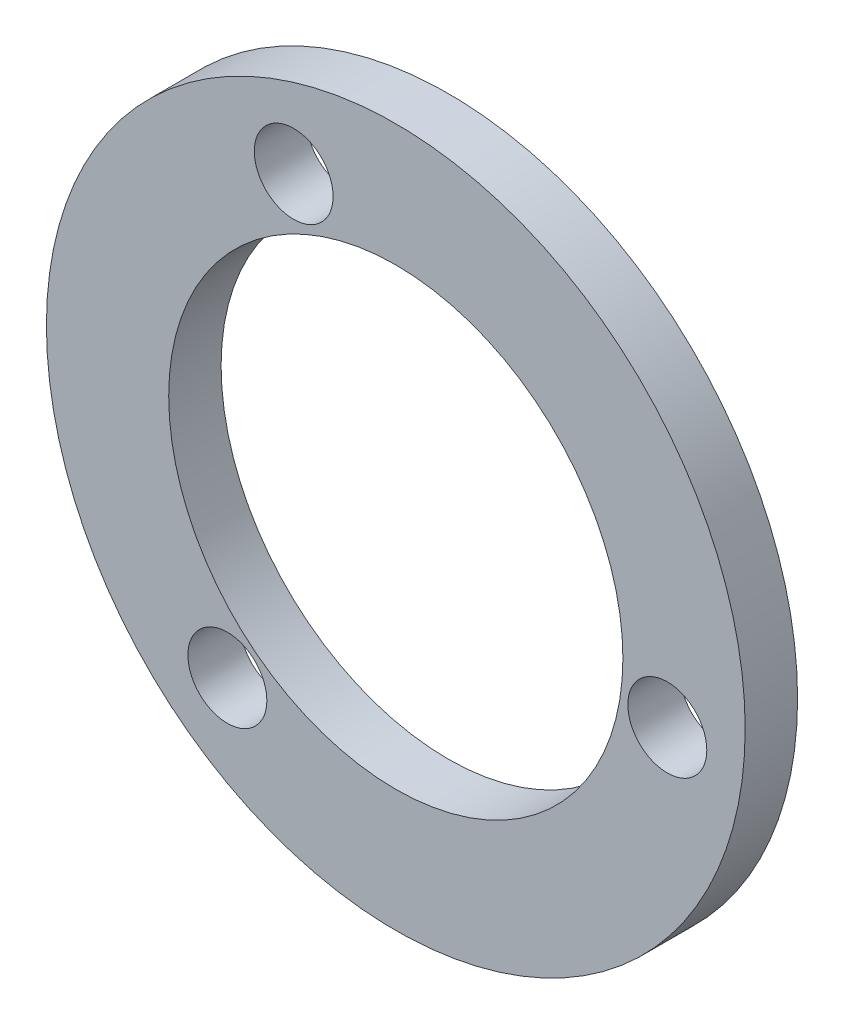
ISO-10303-21;
HEADER;
FILE_DESCRIPTION(('STEP AP214'),'2;1');
FILE_NAME('part.step','',(''),(''),'','','');
FILE_SCHEMA(('AUTOMOTIVE_DESIGN { 1 0 10303 214 1 1 1 1 }'));
ENDSEC;
DATA;
#1=APPLICATION_CONTEXT('core data for automotive mechanical design processes');
#2=APPLICATION_PROTOCOL_DEFINITION('international standard','automotive_design',2000,#1);
#3=PRODUCT_CONTEXT('',#1,'mechanical');
#4=PRODUCT('Part','Part','',(#3));
#5=PRODUCT_RELATED_PRODUCT_CATEGORY('part','',(#4));
#6=PRODUCT_DEFINITION_FORMATION('','',#4);
#7=PRODUCT_DEFINITION_CONTEXT('part definition',#1,'design');
#8=PRODUCT_DEFINITION('design','',#6,#7);
#9=PRODUCT_DEFINITION_SHAPE('','',#8);
#10=(LENGTH_UNIT() NAMED_UNIT(*) SI_UNIT(.MILLI.,.METRE.));
#11=(NAMED_UNIT(*) PLANE_ANGLE_UNIT() SI_UNIT($,.RADIAN.));
#12=(NAMED_UNIT(*) SI_UNIT($,.STERADIAN.) SOLID_ANGLE_UNIT());
#13=UNCERTAINTY_MEASURE_WITH_UNIT(LENGTH_MEASURE(1.E-05),#10,'distance_accuracy_value','');
#14=(GEOMETRIC_REPRESENTATION_CONTEXT(3) GLOBAL_UNCERTAINTY_ASSIGNED_CONTEXT((#13)) GLOBAL_UNIT_ASSIGNED_CONTEXT((#10,
#11,#12)) REPRESENTATION_CONTEXT('',''));
#15=CARTESIAN_POINT('',(0.,0.,0.));
#16=DIRECTION('',(0.,0.,1.));
#17=DIRECTION('',(1.,0.,0.));
#18=AXIS2_PLACEMENT_3D('',#15,#16,#17);
#19=CARTESIAN_POINT('',(197.599478725241,433.875501537189,3.));
#20=DIRECTION('',(0.,0.,1.));
#21=DIRECTION('',(1.,0.,0.));
#22=AXIS2_PLACEMENT_3D('',#19,#20,#21);
#23=PLANE('',#22);
#24=CARTESIAN_POINT('',(213.141718209666,431.718291045942,3.));
#25=DIRECTION('',(0.,0.,1.));
#26=DIRECTION('',(1.,0.,0.));
#27=AXIS2_PLACEMENT_3D('',#24,#25,#26);
#28=CIRCLE('',#27,2.25981114524068);
#29=CARTESIAN_POINT('',(215.401529354907,431.718291045942,3.));
#30=VERTEX_POINT('',#29);
#31=EDGE_CURVE('E64',#30,#30,#28,.T.);
#32=ORIENTED_EDGE('',*,*,#31,.F.);
#33=EDGE_LOOP('',(#32));
#34=FACE_BOUND('',#33,.T.);
#35=CARTESIAN_POINT('',(197.599478725241,433.875501537189,3.));
#36=DIRECTION('',(0.,0.,1.));
#37=DIRECTION('',(1.,0.,0.));
#38=AXIS2_PLACEMENT_3D('',#35,#36,#37);
#39=CIRCLE('',#38,13.);
#40=CARTESIAN_POINT('',(210.599478725241,433.875501537189,3.));
#41=VERTEX_POINT('',#40);
#42=EDGE_CURVE('E50',#41,#41,#39,.T.);
#43=ORIENTED_EDGE('',*,*,#42,.F.);
#44=EDGE_LOOP('',(#43));
#45=FACE_BOUND('',#44,.T.);
#46=CARTESIAN_POINT('',(197.599478725241,433.875501537189,3.));
#47=DIRECTION('',(0.,0.,1.));
#48=DIRECTION('',(1.,0.,0.));
#49=AXIS2_PLACEMENT_3D('',#46,#47,#48);
#50=CIRCLE('',#49,20.);
#51=CARTESIAN_POINT('',(217.599478725241,433.875501537189,3.));
#52=VERTEX_POINT('',#51);
#53=EDGE_CURVE('E10',#52,#52,#50,.T.);
#54=ORIENTED_EDGE('',*,*,#53,.T.);
#55=EDGE_LOOP('',(#54));
#56=FACE_BOUND('',#55,.T.);
#57=CARTESIAN_POINT('',(191.754521775831,448.464909960612,3.));
#58=DIRECTION('',(0.,0.,1.));
#59=DIRECTION('',(1.,0.,0.));
#60=AXIS2_PLACEMENT_3D('',#57,#58,#59);
#61=CIRCLE('',#60,2.25520833087926);
#62=CARTESIAN_POINT('',(194.00973010671,448.464909960612,3.));
#63=VERTEX_POINT('',#62);
#64=EDGE_CURVE('E56',#63,#63,#61,.T.);
#65=ORIENTED_EDGE('',*,*,#64,.F.);
#66=EDGE_LOOP('',(#65));
#67=FACE_BOUND('',#66,.T.);
#68=CARTESIAN_POINT('',(187.958721116064,421.587983347005,3.));
#69=DIRECTION('',(0.,0.,1.));
#70=DIRECTION('',(1.,0.,0.));
#71=AXIS2_PLACEMENT_3D('',#68,#69,#70);
#72=CIRCLE('',#71,2.26019180092882);
#73=CARTESIAN_POINT('',(190.218912916993,421.587983347005,3.));
#74=VERTEX_POINT('',#73);
#75=EDGE_CURVE('E72',#74,#74,#72,.T.);
#76=ORIENTED_EDGE('',*,*,#75,.F.);
#77=EDGE_LOOP('',(#76));
#78=FACE_BOUND('',#77,.T.);
#79=ADVANCED_FACE('F37',(#34,#45,#56,#67,#78),#23,.T.);
#80=CARTESIAN_POINT('',(197.599478725241,433.875501537189,0.));
#81=DIRECTION('',(0.,0.,1.));
#82=DIRECTION('',(1.,0.,0.));
#83=AXIS2_PLACEMENT_3D('',#80,#81,#82);
#84=PLANE('',#83);
#85=CARTESIAN_POINT('',(197.599478725241,433.875501537189,0.));
#86=DIRECTION('',(0.,0.,1.));
#87=DIRECTION('',(1.,0.,0.));
#88=AXIS2_PLACEMENT_3D('',#85,#86,#87);
#89=CIRCLE('',#88,20.);
#90=CARTESIAN_POINT('',(217.599478725241,433.875501537189,0.));
#91=VERTEX_POINT('',#90);
#92=EDGE_CURVE('E41',#91,#91,#89,.T.);
#93=ORIENTED_EDGE('',*,*,#92,.F.);
#94=EDGE_LOOP('',(#93));
#95=FACE_BOUND('',#94,.T.);
#96=CARTESIAN_POINT('',(197.599478725241,433.875501537189,0.));
#97=DIRECTION('',(0.,0.,1.));
#98=DIRECTION('',(1.,0.,0.));
#99=AXIS2_PLACEMENT_3D('',#96,#97,#98);
#100=CIRCLE('',#99,13.);
#101=CARTESIAN_POINT('',(210.599478725241,433.875501537189,0.));
#102=VERTEX_POINT('',#101);
#103=EDGE_CURVE('E52',#102,#102,#100,.T.);
#104=ORIENTED_EDGE('',*,*,#103,.T.);
#105=EDGE_LOOP('',(#104));
#106=FACE_BOUND('',#105,.T.);
#107=CARTESIAN_POINT('',(191.754521775831,448.464909960612,0.));
#108=DIRECTION('',(0.,0.,1.));
#109=DIRECTION('',(1.,0.,0.));
#110=AXIS2_PLACEMENT_3D('',#107,#108,#109);
#111=CIRCLE('',#110,2.25520833087926);
#112=CARTESIAN_POINT('',(194.00973010671,448.464909960612,0.));
#113=VERTEX_POINT('',#112);
#114=EDGE_CURVE('E60',#113,#113,#111,.T.);
#115=ORIENTED_EDGE('',*,*,#114,.T.);
#116=EDGE_LOOP('',(#115));
#117=FACE_BOUND('',#116,.T.);
#118=CARTESIAN_POINT('',(213.141718209666,431.718291045942,0.));
#119=DIRECTION('',(0.,0.,1.));
#120=DIRECTION('',(1.,0.,0.));
#121=AXIS2_PLACEMENT_3D('',#118,#119,#120);
#122=CIRCLE('',#121,2.25981114524068);
#123=CARTESIAN_POINT('',(215.401529354907,431.718291045942,0.));
#124=VERTEX_POINT('',#123);
#125=EDGE_CURVE('E68',#124,#124,#122,.T.);
#126=ORIENTED_EDGE('',*,*,#125,.T.);
#127=EDGE_LOOP('',(#126));
#128=FACE_BOUND('',#127,.T.);
#129=CARTESIAN_POINT('',(187.958721116064,421.587983347005,0.));
#130=DIRECTION('',(0.,0.,1.));
#131=DIRECTION('',(1.,0.,0.));
#132=AXIS2_PLACEMENT_3D('',#129,#130,#131);
#133=CIRCLE('',#132,2.26019180092882);
#134=CARTESIAN_POINT('',(190.218912916993,421.587983347005,0.));
#135=VERTEX_POINT('',#134);
#136=EDGE_CURVE('E76',#135,#135,#133,.T.);
#137=ORIENTED_EDGE('',*,*,#136,.T.);
#138=EDGE_LOOP('',(#137));
#139=FACE_BOUND('',#138,.T.);
#140=ADVANCED_FACE('F88',(#95,#106,#117,#128,#139),#84,.F.);
#141=CARTESIAN_POINT('',(197.599478725241,433.875501537189,3.));
#142=DIRECTION('',(0.,0.,-1.));
#143=DIRECTION('',(-1.,0.,0.));
#144=AXIS2_PLACEMENT_3D('',#141,#142,#143);
#145=CYLINDRICAL_SURFACE('',#144,20.);
#146=ORIENTED_EDGE('',*,*,#53,.F.);
#147=EDGE_LOOP('',(#146));
#148=FACE_BOUND('',#147,.T.);
#149=ORIENTED_EDGE('',*,*,#92,.T.);
#150=EDGE_LOOP('',(#149));
#151=FACE_BOUND('',#150,.T.);
#152=ADVANCED_FACE('F39',(#148,#151),#145,.T.);
#153=CARTESIAN_POINT('',(197.599478725241,433.875501537189,3.));
#154=DIRECTION('',(0.,0.,-1.));
#155=DIRECTION('',(-1.,0.,0.));
#156=AXIS2_PLACEMENT_3D('',#153,#154,#155);
#157=CYLINDRICAL_SURFACE('',#156,13.);
#158=ORIENTED_EDGE('',*,*,#42,.T.);
#159=EDGE_LOOP('',(#158));
#160=FACE_BOUND('',#159,.T.);
#161=ORIENTED_EDGE('',*,*,#103,.F.);
#162=EDGE_LOOP('',(#161));
#163=FACE_BOUND('',#162,.T.);
#164=ADVANCED_FACE('F98',(#160,#163),#157,.F.);
#165=CARTESIAN_POINT('',(191.754521775831,448.464909960612,3.));
#166=DIRECTION('',(0.,0.,-1.));
#167=DIRECTION('',(-1.,0.,0.));
#168=AXIS2_PLACEMENT_3D('',#165,#166,#167);
#169=CYLINDRICAL_SURFACE('',#168,2.25520833087926);
#170=ORIENTED_EDGE('',*,*,#64,.T.);
#171=EDGE_LOOP('',(#170));
#172=FACE_BOUND('',#171,.T.);
#173=ORIENTED_EDGE('',*,*,#114,.F.);
#174=EDGE_LOOP('',(#173));
#175=FACE_BOUND('',#174,.T.);
#176=ADVANCED_FACE('F101',(#172,#175),#169,.F.);
#177=CARTESIAN_POINT('',(213.141718209666,431.718291045942,3.));
#178=DIRECTION('',(0.,0.,-1.));
#179=DIRECTION('',(-1.,0.,0.));
#180=AXIS2_PLACEMENT_3D('',#177,#178,#179);
#181=CYLINDRICAL_SURFACE('',#180,2.25981114524068);
#182=ORIENTED_EDGE('',*,*,#31,.T.);
#183=EDGE_LOOP('',(#182));
#184=FACE_BOUND('',#183,.T.);
#185=ORIENTED_EDGE('',*,*,#125,.F.);
#186=EDGE_LOOP('',(#185));
#187=FACE_BOUND('',#186,.T.);
#188=ADVANCED_FACE('F105',(#184,#187),#181,.F.);
#189=CARTESIAN_POINT('',(187.958721116064,421.587983347005,3.));
#190=DIRECTION('',(0.,0.,-1.));
#191=DIRECTION('',(-1.,0.,0.));
#192=AXIS2_PLACEMENT_3D('',#189,#190,#191);
#193=CYLINDRICAL_SURFACE('',#192,2.26019180092882);
#194=ORIENTED_EDGE('',*,*,#75,.T.);
#195=EDGE_LOOP('',(#194));
#196=FACE_BOUND('',#195,.T.);
#197=ORIENTED_EDGE('',*,*,#136,.F.);
#198=EDGE_LOOP('',(#197));
#199=FACE_BOUND('',#198,.T.);
#200=ADVANCED_FACE('F84',(#196,#199),#193,.F.);
#201=CLOSED_SHELL('',(#79,#140,#152,#164,#176,#188,#200));
#202=MANIFOLD_SOLID_BREP('B2',#201);
#203=ADVANCED_BREP_SHAPE_REPRESENTATION('',(#18,#202),#14);
#204=SHAPE_DEFINITION_REPRESENTATION(#9,#203);
ENDSEC;
END-ISO-10303-21;
